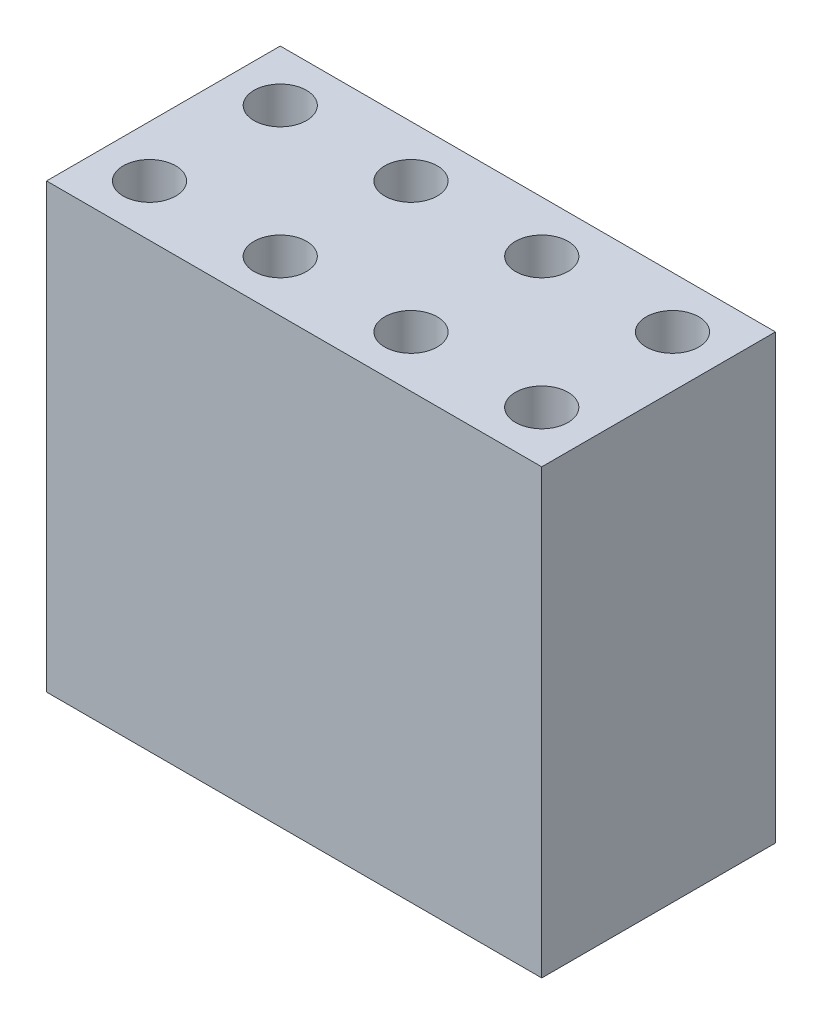
ISO-10303-21;
HEADER;
FILE_DESCRIPTION(('STEP AP214'),'2;1');
FILE_NAME('part.step','',(''),(''),'','','');
FILE_SCHEMA(('AUTOMOTIVE_DESIGN { 1 0 10303 214 1 1 1 1 }'));
ENDSEC;
DATA;
#1=APPLICATION_CONTEXT('core data for automotive mechanical design processes');
#2=APPLICATION_PROTOCOL_DEFINITION('international standard','automotive_design',2000,#1);
#3=PRODUCT_CONTEXT('',#1,'mechanical');
#4=PRODUCT('Part','Part','',(#3));
#5=PRODUCT_RELATED_PRODUCT_CATEGORY('part','',(#4));
#6=PRODUCT_DEFINITION_FORMATION('','',#4);
#7=PRODUCT_DEFINITION_CONTEXT('part definition',#1,'design');
#8=PRODUCT_DEFINITION('design','',#6,#7);
#9=PRODUCT_DEFINITION_SHAPE('','',#8);
#10=(LENGTH_UNIT() NAMED_UNIT(*) SI_UNIT(.MILLI.,.METRE.));
#11=(NAMED_UNIT(*) PLANE_ANGLE_UNIT() SI_UNIT($,.RADIAN.));
#12=(NAMED_UNIT(*) SI_UNIT($,.STERADIAN.) SOLID_ANGLE_UNIT());
#13=UNCERTAINTY_MEASURE_WITH_UNIT(LENGTH_MEASURE(1.E-05),#10,'distance_accuracy_value','');
#14=(GEOMETRIC_REPRESENTATION_CONTEXT(3) GLOBAL_UNCERTAINTY_ASSIGNED_CONTEXT((#13)) GLOBAL_UNIT_ASSIGNED_CONTEXT((#10,
#11,#12)) REPRESENTATION_CONTEXT('',''));
#15=CARTESIAN_POINT('',(0.,0.,0.));
#16=DIRECTION('',(0.,0.,1.));
#17=DIRECTION('',(1.,0.,0.));
#18=AXIS2_PLACEMENT_3D('',#15,#16,#17);
#19=CARTESIAN_POINT('',(0.,8.6,0.));
#20=DIRECTION('',(0.,-1.,0.));
#21=DIRECTION('',(0.,0.,-1.));
#22=AXIS2_PLACEMENT_3D('',#19,#20,#21);
#23=PLANE('',#22);
#24=CARTESIAN_POINT('',(-1.27001,8.6,-1.27));
#25=DIRECTION('',(0.,-1.,0.));
#26=DIRECTION('',(0.,0.,-1.));
#27=AXIS2_PLACEMENT_3D('',#24,#25,#26);
#28=CIRCLE('',#27,0.51);
#29=CARTESIAN_POINT('',(-1.27001,8.6,-1.78));
#30=VERTEX_POINT('',#29);
#31=EDGE_CURVE('E260',#30,#30,#28,.T.);
#32=ORIENTED_EDGE('',*,*,#31,.T.);
#33=EDGE_LOOP('',(#32));
#34=FACE_BOUND('',#33,.T.);
#35=CARTESIAN_POINT('',(3.80997,8.6,-1.27));
#36=DIRECTION('',(0.,-1.,0.));
#37=DIRECTION('',(0.,0.,-1.));
#38=AXIS2_PLACEMENT_3D('',#35,#36,#37);
#39=CIRCLE('',#38,0.509999999999999);
#40=CARTESIAN_POINT('',(3.80997,8.6,-1.78));
#41=VERTEX_POINT('',#40);
#42=EDGE_CURVE('E274',#41,#41,#39,.T.);
#43=ORIENTED_EDGE('',*,*,#42,.T.);
#44=EDGE_LOOP('',(#43));
#45=FACE_BOUND('',#44,.T.);
#46=CARTESIAN_POINT('',(1.26998,8.6,-1.27));
#47=DIRECTION('',(0.,-1.,0.));
#48=DIRECTION('',(0.,0.,-1.));
#49=AXIS2_PLACEMENT_3D('',#46,#47,#48);
#50=CIRCLE('',#49,0.51);
#51=CARTESIAN_POINT('',(1.26998,8.6,-1.78));
#52=VERTEX_POINT('',#51);
#53=EDGE_CURVE('E278',#52,#52,#50,.T.);
#54=ORIENTED_EDGE('',*,*,#53,.T.);
#55=EDGE_LOOP('',(#54));
#56=FACE_BOUND('',#55,.T.);
#57=CARTESIAN_POINT('',(-3.81,8.6,-1.27));
#58=DIRECTION('',(0.,-1.,0.));
#59=DIRECTION('',(0.,0.,-1.));
#60=AXIS2_PLACEMENT_3D('',#57,#58,#59);
#61=CIRCLE('',#60,0.51);
#62=CARTESIAN_POINT('',(-3.81,8.6,-1.78));
#63=VERTEX_POINT('',#62);
#64=EDGE_CURVE('E221',#63,#63,#61,.T.);
#65=ORIENTED_EDGE('',*,*,#64,.T.);
#66=EDGE_LOOP('',(#65));
#67=FACE_BOUND('',#66,.T.);
#68=DIRECTION('',(1.,0.,0.));
#69=VECTOR('',#68,1.);
#70=CARTESIAN_POINT('',(-4.80997,8.6,2.27));
#71=LINE('',#70,#69);
#72=CARTESIAN_POINT('',(-4.80997,8.6,2.27));
#73=VERTEX_POINT('',#72);
#74=CARTESIAN_POINT('',(4.80997,8.6,2.27));
#75=VERTEX_POINT('',#74);
#76=EDGE_CURVE('E195',#73,#75,#71,.T.);
#77=ORIENTED_EDGE('',*,*,#76,.T.);
#78=DIRECTION('',(0.,0.,1.));
#79=VECTOR('',#78,1.);
#80=CARTESIAN_POINT('',(4.80997,8.6,-2.27));
#81=LINE('',#80,#79);
#82=CARTESIAN_POINT('',(4.80997,8.6,-2.27));
#83=VERTEX_POINT('',#82);
#84=EDGE_CURVE('E202',#83,#75,#81,.T.);
#85=ORIENTED_EDGE('',*,*,#84,.F.);
#86=DIRECTION('',(1.,0.,0.));
#87=VECTOR('',#86,1.);
#88=CARTESIAN_POINT('',(-4.80997,8.6,-2.27));
#89=LINE('',#88,#87);
#90=CARTESIAN_POINT('',(-4.80997,8.6,-2.27));
#91=VERTEX_POINT('',#90);
#92=EDGE_CURVE('E210',#91,#83,#89,.T.);
#93=ORIENTED_EDGE('',*,*,#92,.F.);
#94=DIRECTION('',(0.,0.,1.));
#95=VECTOR('',#94,1.);
#96=CARTESIAN_POINT('',(-4.80997,8.6,-2.27));
#97=LINE('',#96,#95);
#98=EDGE_CURVE('E172',#91,#73,#97,.T.);
#99=ORIENTED_EDGE('',*,*,#98,.T.);
#100=EDGE_LOOP('',(#77,#85,#93,#99));
#101=FACE_BOUND('',#100,.T.);
#102=CARTESIAN_POINT('',(-1.27001,8.6,1.27));
#103=DIRECTION('',(0.,1.,0.));
#104=DIRECTION('',(0.,0.,1.));
#105=AXIS2_PLACEMENT_3D('',#102,#103,#104);
#106=CIRCLE('',#105,0.51);
#107=CARTESIAN_POINT('',(-1.27001,8.6,1.78));
#108=VERTEX_POINT('',#107);
#109=EDGE_CURVE('E283',#108,#108,#106,.T.);
#110=ORIENTED_EDGE('',*,*,#109,.F.);
#111=EDGE_LOOP('',(#110));
#112=FACE_BOUND('',#111,.T.);
#113=CARTESIAN_POINT('',(3.80997,8.6,1.27));
#114=DIRECTION('',(0.,1.,0.));
#115=DIRECTION('',(0.,0.,1.));
#116=AXIS2_PLACEMENT_3D('',#113,#114,#115);
#117=CIRCLE('',#116,0.509999999999999);
#118=CARTESIAN_POINT('',(3.80997,8.6,1.78));
#119=VERTEX_POINT('',#118);
#120=EDGE_CURVE('E270',#119,#119,#117,.T.);
#121=ORIENTED_EDGE('',*,*,#120,.F.);
#122=EDGE_LOOP('',(#121));
#123=FACE_BOUND('',#122,.T.);
#124=CARTESIAN_POINT('',(1.26998,8.6,1.27));
#125=DIRECTION('',(0.,1.,0.));
#126=DIRECTION('',(0.,0.,1.));
#127=AXIS2_PLACEMENT_3D('',#124,#125,#126);
#128=CIRCLE('',#127,0.51);
#129=CARTESIAN_POINT('',(1.26998,8.6,1.78));
#130=VERTEX_POINT('',#129);
#131=EDGE_CURVE('E265',#130,#130,#128,.T.);
#132=ORIENTED_EDGE('',*,*,#131,.F.);
#133=EDGE_LOOP('',(#132));
#134=FACE_BOUND('',#133,.T.);
#135=CARTESIAN_POINT('',(-3.81,8.6,1.27));
#136=DIRECTION('',(0.,1.,0.));
#137=DIRECTION('',(0.,0.,1.));
#138=AXIS2_PLACEMENT_3D('',#135,#136,#137);
#139=CIRCLE('',#138,0.51);
#140=CARTESIAN_POINT('',(-3.81,8.6,1.78));
#141=VERTEX_POINT('',#140);
#142=EDGE_CURVE('E255',#141,#141,#139,.T.);
#143=ORIENTED_EDGE('',*,*,#142,.F.);
#144=EDGE_LOOP('',(#143));
#145=FACE_BOUND('',#144,.T.);
#146=ADVANCED_FACE('F155',(#34,#45,#56,#67,#101,#112,#123,#134,#145),#23,.F.);
#147=CARTESIAN_POINT('',(0.,0.,0.));
#148=DIRECTION('',(0.,-1.,0.));
#149=DIRECTION('',(0.,0.,-1.));
#150=AXIS2_PLACEMENT_3D('',#147,#148,#149);
#151=PLANE('',#150);
#152=CARTESIAN_POINT('',(1.26998,0.,1.27));
#153=DIRECTION('',(0.,1.,0.));
#154=DIRECTION('',(0.,0.,1.));
#155=AXIS2_PLACEMENT_3D('',#152,#153,#154);
#156=CIRCLE('',#155,0.51);
#157=CARTESIAN_POINT('',(1.26998,0.,1.78));
#158=VERTEX_POINT('',#157);
#159=EDGE_CURVE('E263',#158,#158,#156,.T.);
#160=ORIENTED_EDGE('',*,*,#159,.T.);
#161=EDGE_LOOP('',(#160));
#162=FACE_BOUND('',#161,.T.);
#163=CARTESIAN_POINT('',(-1.27001,0.,1.27));
#164=DIRECTION('',(0.,1.,0.));
#165=DIRECTION('',(0.,0.,1.));
#166=AXIS2_PLACEMENT_3D('',#163,#164,#165);
#167=CIRCLE('',#166,0.51);
#168=CARTESIAN_POINT('',(-1.27001,0.,1.78));
#169=VERTEX_POINT('',#168);
#170=EDGE_CURVE('E281',#169,#169,#167,.T.);
#171=ORIENTED_EDGE('',*,*,#170,.T.);
#172=EDGE_LOOP('',(#171));
#173=FACE_BOUND('',#172,.T.);
#174=CARTESIAN_POINT('',(-3.81,0.,-1.27));
#175=DIRECTION('',(0.,-1.,0.));
#176=DIRECTION('',(0.,0.,-1.));
#177=AXIS2_PLACEMENT_3D('',#174,#175,#176);
#178=CIRCLE('',#177,0.51);
#179=CARTESIAN_POINT('',(-3.81,0.,-1.78));
#180=VERTEX_POINT('',#179);
#181=EDGE_CURVE('E286',#180,#180,#178,.T.);
#182=ORIENTED_EDGE('',*,*,#181,.F.);
#183=EDGE_LOOP('',(#182));
#184=FACE_BOUND('',#183,.T.);
#185=DIRECTION('',(1.,0.,0.));
#186=VECTOR('',#185,1.);
#187=CARTESIAN_POINT('',(-4.80997,0.,2.27));
#188=LINE('',#187,#186);
#189=CARTESIAN_POINT('',(-4.80997,0.,2.27));
#190=VERTEX_POINT('',#189);
#191=CARTESIAN_POINT('',(4.80997,0.,2.27));
#192=VERTEX_POINT('',#191);
#193=EDGE_CURVE('E218',#190,#192,#188,.T.);
#194=ORIENTED_EDGE('',*,*,#193,.F.);
#195=DIRECTION('',(0.,0.,1.));
#196=VECTOR('',#195,1.);
#197=CARTESIAN_POINT('',(-4.80997,0.,-2.27));
#198=LINE('',#197,#196);
#199=CARTESIAN_POINT('',(-4.80997,0.,-2.27));
#200=VERTEX_POINT('',#199);
#201=EDGE_CURVE('E190',#200,#190,#198,.T.);
#202=ORIENTED_EDGE('',*,*,#201,.F.);
#203=DIRECTION('',(1.,0.,0.));
#204=VECTOR('',#203,1.);
#205=CARTESIAN_POINT('',(-4.80997,0.,-2.27));
#206=LINE('',#205,#204);
#207=CARTESIAN_POINT('',(4.80997,0.,-2.27));
#208=VERTEX_POINT('',#207);
#209=EDGE_CURVE('E223',#200,#208,#206,.T.);
#210=ORIENTED_EDGE('',*,*,#209,.T.);
#211=DIRECTION('',(0.,0.,1.));
#212=VECTOR('',#211,1.);
#213=CARTESIAN_POINT('',(4.80997,0.,-2.27));
#214=LINE('',#213,#212);
#215=EDGE_CURVE('E204',#208,#192,#214,.T.);
#216=ORIENTED_EDGE('',*,*,#215,.T.);
#217=EDGE_LOOP('',(#194,#202,#210,#216));
#218=FACE_BOUND('',#217,.T.);
#219=CARTESIAN_POINT('',(1.26998,0.,-1.27));
#220=DIRECTION('',(0.,-1.,0.));
#221=DIRECTION('',(0.,0.,-1.));
#222=AXIS2_PLACEMENT_3D('',#219,#220,#221);
#223=CIRCLE('',#222,0.51);
#224=CARTESIAN_POINT('',(1.26998,0.,-1.78));
#225=VERTEX_POINT('',#224);
#226=EDGE_CURVE('E238',#225,#225,#223,.T.);
#227=ORIENTED_EDGE('',*,*,#226,.F.);
#228=EDGE_LOOP('',(#227));
#229=FACE_BOUND('',#228,.T.);
#230=CARTESIAN_POINT('',(3.80997,0.,-1.27));
#231=DIRECTION('',(0.,-1.,0.));
#232=DIRECTION('',(0.,0.,-1.));
#233=AXIS2_PLACEMENT_3D('',#230,#231,#232);
#234=CIRCLE('',#233,0.509999999999999);
#235=CARTESIAN_POINT('',(3.80997,0.,-1.78));
#236=VERTEX_POINT('',#235);
#237=EDGE_CURVE('E242',#236,#236,#234,.T.);
#238=ORIENTED_EDGE('',*,*,#237,.F.);
#239=EDGE_LOOP('',(#238));
#240=FACE_BOUND('',#239,.T.);
#241=CARTESIAN_POINT('',(3.80997,0.,1.27));
#242=DIRECTION('',(0.,1.,0.));
#243=DIRECTION('',(0.,0.,1.));
#244=AXIS2_PLACEMENT_3D('',#241,#242,#243);
#245=CIRCLE('',#244,0.509999999999999);
#246=CARTESIAN_POINT('',(3.80997,0.,1.78));
#247=VERTEX_POINT('',#246);
#248=EDGE_CURVE('E246',#247,#247,#245,.T.);
#249=ORIENTED_EDGE('',*,*,#248,.T.);
#250=EDGE_LOOP('',(#249));
#251=FACE_BOUND('',#250,.T.);
#252=CARTESIAN_POINT('',(-1.27001,0.,-1.27));
#253=DIRECTION('',(0.,-1.,0.));
#254=DIRECTION('',(0.,0.,-1.));
#255=AXIS2_PLACEMENT_3D('',#252,#253,#254);
#256=CIRCLE('',#255,0.51);
#257=CARTESIAN_POINT('',(-1.27001,0.,-1.78));
#258=VERTEX_POINT('',#257);
#259=EDGE_CURVE('E250',#258,#258,#256,.T.);
#260=ORIENTED_EDGE('',*,*,#259,.F.);
#261=EDGE_LOOP('',(#260));
#262=FACE_BOUND('',#261,.T.);
#263=CARTESIAN_POINT('',(-3.81,0.,1.27));
#264=DIRECTION('',(0.,1.,0.));
#265=DIRECTION('',(0.,0.,1.));
#266=AXIS2_PLACEMENT_3D('',#263,#264,#265);
#267=CIRCLE('',#266,0.51);
#268=CARTESIAN_POINT('',(-3.81,0.,1.78));
#269=VERTEX_POINT('',#268);
#270=EDGE_CURVE('E253',#269,#269,#267,.T.);
#271=ORIENTED_EDGE('',*,*,#270,.T.);
#272=EDGE_LOOP('',(#271));
#273=FACE_BOUND('',#272,.T.);
#274=ADVANCED_FACE('F230',(#162,#173,#184,#218,#229,#240,#251,#262,#273),#151,.T.);
#275=CARTESIAN_POINT('',(-4.80997,8.6,2.27));
#276=DIRECTION('',(0.,0.,-1.));
#277=DIRECTION('',(-1.,0.,0.));
#278=AXIS2_PLACEMENT_3D('',#275,#276,#277);
#279=PLANE('',#278);
#280=ORIENTED_EDGE('',*,*,#193,.T.);
#281=DIRECTION('',(0.,-1.,0.));
#282=VECTOR('',#281,1.);
#283=CARTESIAN_POINT('',(4.80997,8.6,2.27));
#284=LINE('',#283,#282);
#285=EDGE_CURVE('E12',#75,#192,#284,.T.);
#286=ORIENTED_EDGE('',*,*,#285,.F.);
#287=ORIENTED_EDGE('',*,*,#76,.F.);
#288=DIRECTION('',(0.,-1.,0.));
#289=VECTOR('',#288,1.);
#290=CARTESIAN_POINT('',(-4.80997,8.6,2.27));
#291=LINE('',#290,#289);
#292=EDGE_CURVE('E214',#73,#190,#291,.T.);
#293=ORIENTED_EDGE('',*,*,#292,.T.);
#294=EDGE_LOOP('',(#280,#286,#287,#293));
#295=FACE_BOUND('',#294,.T.);
#296=ADVANCED_FACE('F157',(#295),#279,.F.);
#297=CARTESIAN_POINT('',(4.80997,8.6,-2.27));
#298=DIRECTION('',(1.,0.,0.));
#299=DIRECTION('',(0.,0.,-1.));
#300=AXIS2_PLACEMENT_3D('',#297,#298,#299);
#301=PLANE('',#300);
#302=ORIENTED_EDGE('',*,*,#215,.F.);
#303=DIRECTION('',(0.,-1.,0.));
#304=VECTOR('',#303,1.);
#305=CARTESIAN_POINT('',(4.80997,8.6,-2.27));
#306=LINE('',#305,#304);
#307=EDGE_CURVE('E164',#83,#208,#306,.T.);
#308=ORIENTED_EDGE('',*,*,#307,.F.);
#309=ORIENTED_EDGE('',*,*,#84,.T.);
#310=ORIENTED_EDGE('',*,*,#285,.T.);
#311=EDGE_LOOP('',(#302,#308,#309,#310));
#312=FACE_BOUND('',#311,.T.);
#313=ADVANCED_FACE('F201',(#312),#301,.T.);
#314=CARTESIAN_POINT('',(-4.80997,8.6,-2.27));
#315=DIRECTION('',(0.,0.,-1.));
#316=DIRECTION('',(-1.,0.,0.));
#317=AXIS2_PLACEMENT_3D('',#314,#315,#316);
#318=PLANE('',#317);
#319=ORIENTED_EDGE('',*,*,#209,.F.);
#320=DIRECTION('',(0.,-1.,0.));
#321=VECTOR('',#320,1.);
#322=CARTESIAN_POINT('',(-4.80997,8.6,-2.27));
#323=LINE('',#322,#321);
#324=EDGE_CURVE('E187',#91,#200,#323,.T.);
#325=ORIENTED_EDGE('',*,*,#324,.F.);
#326=ORIENTED_EDGE('',*,*,#92,.T.);
#327=ORIENTED_EDGE('',*,*,#307,.T.);
#328=EDGE_LOOP('',(#319,#325,#326,#327));
#329=FACE_BOUND('',#328,.T.);
#330=ADVANCED_FACE('F212',(#329),#318,.T.);
#331=CARTESIAN_POINT('',(-4.80997,8.6,-2.27));
#332=DIRECTION('',(1.,0.,0.));
#333=DIRECTION('',(0.,0.,-1.));
#334=AXIS2_PLACEMENT_3D('',#331,#332,#333);
#335=PLANE('',#334);
#336=ORIENTED_EDGE('',*,*,#201,.T.);
#337=ORIENTED_EDGE('',*,*,#292,.F.);
#338=ORIENTED_EDGE('',*,*,#98,.F.);
#339=ORIENTED_EDGE('',*,*,#324,.T.);
#340=EDGE_LOOP('',(#336,#337,#338,#339));
#341=FACE_BOUND('',#340,.T.);
#342=ADVANCED_FACE('F298',(#341),#335,.F.);
#343=CARTESIAN_POINT('',(-3.81,8.6,-1.27));
#344=DIRECTION('',(0.,-1.,0.));
#345=DIRECTION('',(0.,0.,-1.));
#346=AXIS2_PLACEMENT_3D('',#343,#344,#345);
#347=CYLINDRICAL_SURFACE('',#346,0.51);
#348=ORIENTED_EDGE('',*,*,#64,.F.);
#349=EDGE_LOOP('',(#348));
#350=FACE_BOUND('',#349,.T.);
#351=ORIENTED_EDGE('',*,*,#181,.T.);
#352=EDGE_LOOP('',(#351));
#353=FACE_BOUND('',#352,.T.);
#354=ADVANCED_FACE('F294',(#350,#353),#347,.F.);
#355=CARTESIAN_POINT('',(-1.27001,8.6,1.27));
#356=DIRECTION('',(0.,-1.,0.));
#357=DIRECTION('',(0.,0.,-1.));
#358=AXIS2_PLACEMENT_3D('',#355,#356,#357);
#359=CYLINDRICAL_SURFACE('',#358,0.51);
#360=ORIENTED_EDGE('',*,*,#109,.T.);
#361=EDGE_LOOP('',(#360));
#362=FACE_BOUND('',#361,.T.);
#363=ORIENTED_EDGE('',*,*,#170,.F.);
#364=EDGE_LOOP('',(#363));
#365=FACE_BOUND('',#364,.T.);
#366=ADVANCED_FACE('F297',(#362,#365),#359,.F.);
#367=CARTESIAN_POINT('',(1.26998,8.6,-1.27));
#368=DIRECTION('',(0.,-1.,0.));
#369=DIRECTION('',(0.,0.,-1.));
#370=AXIS2_PLACEMENT_3D('',#367,#368,#369);
#371=CYLINDRICAL_SURFACE('',#370,0.51);
#372=ORIENTED_EDGE('',*,*,#53,.F.);
#373=EDGE_LOOP('',(#372));
#374=FACE_BOUND('',#373,.T.);
#375=ORIENTED_EDGE('',*,*,#226,.T.);
#376=EDGE_LOOP('',(#375));
#377=FACE_BOUND('',#376,.T.);
#378=ADVANCED_FACE('F305',(#374,#377),#371,.F.);
#379=CARTESIAN_POINT('',(3.80997,8.6,-1.27));
#380=DIRECTION('',(0.,-1.,0.));
#381=DIRECTION('',(0.,0.,-1.));
#382=AXIS2_PLACEMENT_3D('',#379,#380,#381);
#383=CYLINDRICAL_SURFACE('',#382,0.509999999999999);
#384=ORIENTED_EDGE('',*,*,#42,.F.);
#385=EDGE_LOOP('',(#384));
#386=FACE_BOUND('',#385,.T.);
#387=ORIENTED_EDGE('',*,*,#237,.T.);
#388=EDGE_LOOP('',(#387));
#389=FACE_BOUND('',#388,.T.);
#390=ADVANCED_FACE('F367',(#386,#389),#383,.F.);
#391=CARTESIAN_POINT('',(3.80997,8.6,1.27));
#392=DIRECTION('',(0.,-1.,0.));
#393=DIRECTION('',(0.,0.,-1.));
#394=AXIS2_PLACEMENT_3D('',#391,#392,#393);
#395=CYLINDRICAL_SURFACE('',#394,0.509999999999999);
#396=ORIENTED_EDGE('',*,*,#120,.T.);
#397=EDGE_LOOP('',(#396));
#398=FACE_BOUND('',#397,.T.);
#399=ORIENTED_EDGE('',*,*,#248,.F.);
#400=EDGE_LOOP('',(#399));
#401=FACE_BOUND('',#400,.T.);
#402=ADVANCED_FACE('F376',(#398,#401),#395,.F.);
#403=CARTESIAN_POINT('',(1.26998,8.6,1.27));
#404=DIRECTION('',(0.,-1.,0.));
#405=DIRECTION('',(0.,0.,-1.));
#406=AXIS2_PLACEMENT_3D('',#403,#404,#405);
#407=CYLINDRICAL_SURFACE('',#406,0.51);
#408=ORIENTED_EDGE('',*,*,#131,.T.);
#409=EDGE_LOOP('',(#408));
#410=FACE_BOUND('',#409,.T.);
#411=ORIENTED_EDGE('',*,*,#159,.F.);
#412=EDGE_LOOP('',(#411));
#413=FACE_BOUND('',#412,.T.);
#414=ADVANCED_FACE('F385',(#410,#413),#407,.F.);
#415=CARTESIAN_POINT('',(-1.27001,8.6,-1.27));
#416=DIRECTION('',(0.,-1.,0.));
#417=DIRECTION('',(0.,0.,-1.));
#418=AXIS2_PLACEMENT_3D('',#415,#416,#417);
#419=CYLINDRICAL_SURFACE('',#418,0.51);
#420=ORIENTED_EDGE('',*,*,#31,.F.);
#421=EDGE_LOOP('',(#420));
#422=FACE_BOUND('',#421,.T.);
#423=ORIENTED_EDGE('',*,*,#259,.T.);
#424=EDGE_LOOP('',(#423));
#425=FACE_BOUND('',#424,.T.);
#426=ADVANCED_FACE('F394',(#422,#425),#419,.F.);
#427=CARTESIAN_POINT('',(-3.81,8.6,1.27));
#428=DIRECTION('',(0.,-1.,0.));
#429=DIRECTION('',(0.,0.,-1.));
#430=AXIS2_PLACEMENT_3D('',#427,#428,#429);
#431=CYLINDRICAL_SURFACE('',#430,0.51);
#432=ORIENTED_EDGE('',*,*,#142,.T.);
#433=EDGE_LOOP('',(#432));
#434=FACE_BOUND('',#433,.T.);
#435=ORIENTED_EDGE('',*,*,#270,.F.);
#436=EDGE_LOOP('',(#435));
#437=FACE_BOUND('',#436,.T.);
#438=ADVANCED_FACE('F403',(#434,#437),#431,.F.);
#439=CLOSED_SHELL('',(#146,#274,#296,#313,#330,#342,#354,#366,#378,#390,#402,#414,#426,#438));
#440=MANIFOLD_SOLID_BREP('B2',#439);
#441=ADVANCED_BREP_SHAPE_REPRESENTATION('',(#18,#440),#14);
#442=SHAPE_DEFINITION_REPRESENTATION(#9,#441);
ENDSEC;
END-ISO-10303-21;
